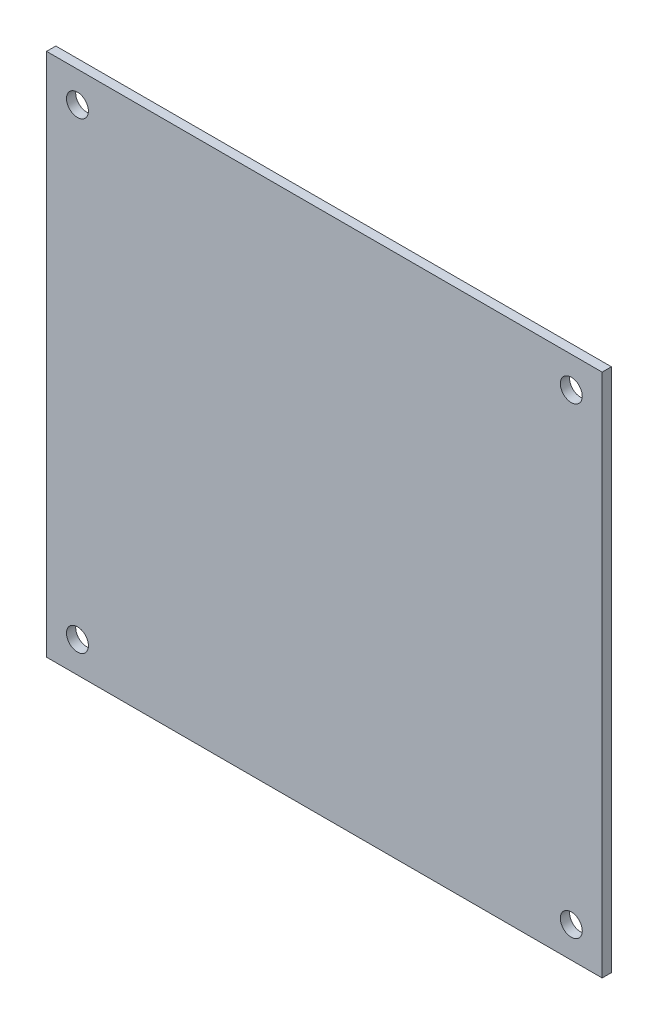
ISO-10303-21;
HEADER;
FILE_DESCRIPTION(('STEP AP214'),'2;1');
FILE_NAME('part.step','',(''),(''),'','','');
FILE_SCHEMA(('AUTOMOTIVE_DESIGN { 1 0 10303 214 1 1 1 1 }'));
ENDSEC;
DATA;
#1=APPLICATION_CONTEXT('core data for automotive mechanical design processes');
#2=APPLICATION_PROTOCOL_DEFINITION('international standard','automotive_design',2000,#1);
#3=PRODUCT_CONTEXT('',#1,'mechanical');
#4=PRODUCT('Part','Part','',(#3));
#5=PRODUCT_RELATED_PRODUCT_CATEGORY('part','',(#4));
#6=PRODUCT_DEFINITION_FORMATION('','',#4);
#7=PRODUCT_DEFINITION_CONTEXT('part definition',#1,'design');
#8=PRODUCT_DEFINITION('design','',#6,#7);
#9=PRODUCT_DEFINITION_SHAPE('','',#8);
#10=(LENGTH_UNIT() NAMED_UNIT(*) SI_UNIT(.MILLI.,.METRE.));
#11=(NAMED_UNIT(*) PLANE_ANGLE_UNIT() SI_UNIT($,.RADIAN.));
#12=(NAMED_UNIT(*) SI_UNIT($,.STERADIAN.) SOLID_ANGLE_UNIT());
#13=UNCERTAINTY_MEASURE_WITH_UNIT(LENGTH_MEASURE(1.E-05),#10,'distance_accuracy_value','');
#14=(GEOMETRIC_REPRESENTATION_CONTEXT(3) GLOBAL_UNCERTAINTY_ASSIGNED_CONTEXT((#13)) GLOBAL_UNIT_ASSIGNED_CONTEXT((#10,
#11,#12)) REPRESENTATION_CONTEXT('',''));
#15=CARTESIAN_POINT('',(0.,0.,0.));
#16=DIRECTION('',(0.,0.,1.));
#17=DIRECTION('',(1.,0.,0.));
#18=AXIS2_PLACEMENT_3D('',#15,#16,#17);
#19=CARTESIAN_POINT('',(0.,0.,1.5));
#20=DIRECTION('',(0.,0.,1.));
#21=DIRECTION('',(1.,0.,0.));
#22=AXIS2_PLACEMENT_3D('',#19,#20,#21);
#23=PLANE('',#22);
#24=CARTESIAN_POINT('',(40.,37.5,1.5));
#25=DIRECTION('',(0.,0.,1.));
#26=DIRECTION('',(1.,0.,0.));
#27=AXIS2_PLACEMENT_3D('',#24,#25,#26);
#28=CIRCLE('',#27,1.778);
#29=CARTESIAN_POINT('',(41.778,37.5,1.5));
#30=VERTEX_POINT('',#29);
#31=EDGE_CURVE('E121',#30,#30,#28,.T.);
#32=ORIENTED_EDGE('',*,*,#31,.F.);
#33=EDGE_LOOP('',(#32));
#34=FACE_BOUND('',#33,.T.);
#35=CARTESIAN_POINT('',(-40.,37.5,1.5));
#36=DIRECTION('',(0.,0.,1.));
#37=DIRECTION('',(1.,0.,0.));
#38=AXIS2_PLACEMENT_3D('',#35,#36,#37);
#39=CIRCLE('',#38,1.778);
#40=CARTESIAN_POINT('',(-38.222,37.5,1.5));
#41=VERTEX_POINT('',#40);
#42=EDGE_CURVE('E100',#41,#41,#39,.T.);
#43=ORIENTED_EDGE('',*,*,#42,.F.);
#44=EDGE_LOOP('',(#43));
#45=FACE_BOUND('',#44,.T.);
#46=DIRECTION('',(0.,1.,0.));
#47=VECTOR('',#46,1.);
#48=CARTESIAN_POINT('',(45.,42.5,1.5));
#49=LINE('',#48,#47);
#50=CARTESIAN_POINT('',(45.,-42.5,1.5));
#51=VERTEX_POINT('',#50);
#52=CARTESIAN_POINT('',(45.,42.5,1.5));
#53=VERTEX_POINT('',#52);
#54=EDGE_CURVE('E85',#51,#53,#49,.T.);
#55=ORIENTED_EDGE('',*,*,#54,.T.);
#56=DIRECTION('',(-1.,0.,0.));
#57=VECTOR('',#56,1.);
#58=CARTESIAN_POINT('',(-45.,42.5,1.5));
#59=LINE('',#58,#57);
#60=CARTESIAN_POINT('',(-45.,42.5,1.5));
#61=VERTEX_POINT('',#60);
#62=EDGE_CURVE('E80',#53,#61,#59,.T.);
#63=ORIENTED_EDGE('',*,*,#62,.T.);
#64=DIRECTION('',(0.,-1.,0.));
#65=VECTOR('',#64,1.);
#66=CARTESIAN_POINT('',(-45.,42.5,1.5));
#67=LINE('',#66,#65);
#68=CARTESIAN_POINT('',(-45.,-42.5,1.5));
#69=VERTEX_POINT('',#68);
#70=EDGE_CURVE('E83',#61,#69,#67,.T.);
#71=ORIENTED_EDGE('',*,*,#70,.T.);
#72=DIRECTION('',(1.,0.,0.));
#73=VECTOR('',#72,1.);
#74=CARTESIAN_POINT('',(-45.,-42.5,1.5));
#75=LINE('',#74,#73);
#76=EDGE_CURVE('E50',#69,#51,#75,.T.);
#77=ORIENTED_EDGE('',*,*,#76,.T.);
#78=EDGE_LOOP('',(#55,#63,#71,#77));
#79=FACE_BOUND('',#78,.T.);
#80=CARTESIAN_POINT('',(-40.,-37.5,1.5));
#81=DIRECTION('',(0.,0.,1.));
#82=DIRECTION('',(1.,0.,0.));
#83=AXIS2_PLACEMENT_3D('',#80,#81,#82);
#84=CIRCLE('',#83,1.778);
#85=CARTESIAN_POINT('',(-38.222,-37.5,1.5));
#86=VERTEX_POINT('',#85);
#87=EDGE_CURVE('E115',#86,#86,#84,.T.);
#88=ORIENTED_EDGE('',*,*,#87,.F.);
#89=EDGE_LOOP('',(#88));
#90=FACE_BOUND('',#89,.T.);
#91=CARTESIAN_POINT('',(40.,-37.5,1.5));
#92=DIRECTION('',(0.,0.,1.));
#93=DIRECTION('',(1.,0.,0.));
#94=AXIS2_PLACEMENT_3D('',#91,#92,#93);
#95=CIRCLE('',#94,1.778);
#96=CARTESIAN_POINT('',(41.778,-37.5,1.5));
#97=VERTEX_POINT('',#96);
#98=EDGE_CURVE('E127',#97,#97,#95,.T.);
#99=ORIENTED_EDGE('',*,*,#98,.F.);
#100=EDGE_LOOP('',(#99));
#101=FACE_BOUND('',#100,.T.);
#102=ADVANCED_FACE('F33',(#34,#45,#79,#90,#101),#23,.T.);
#103=CARTESIAN_POINT('',(0.,0.,0.));
#104=DIRECTION('',(0.,0.,1.));
#105=DIRECTION('',(1.,0.,0.));
#106=AXIS2_PLACEMENT_3D('',#103,#104,#105);
#107=PLANE('',#106);
#108=DIRECTION('',(0.,1.,0.));
#109=VECTOR('',#108,1.);
#110=CARTESIAN_POINT('',(45.,42.5,0.));
#111=LINE('',#110,#109);
#112=CARTESIAN_POINT('',(45.,-42.5,0.));
#113=VERTEX_POINT('',#112);
#114=CARTESIAN_POINT('',(45.,42.5,0.));
#115=VERTEX_POINT('',#114);
#116=EDGE_CURVE('E97',#113,#115,#111,.T.);
#117=ORIENTED_EDGE('',*,*,#116,.F.);
#118=DIRECTION('',(1.,0.,0.));
#119=VECTOR('',#118,1.);
#120=CARTESIAN_POINT('',(-45.,-42.5,0.));
#121=LINE('',#120,#119);
#122=CARTESIAN_POINT('',(-45.,-42.5,0.));
#123=VERTEX_POINT('',#122);
#124=EDGE_CURVE('E73',#123,#113,#121,.T.);
#125=ORIENTED_EDGE('',*,*,#124,.F.);
#126=DIRECTION('',(0.,-1.,0.));
#127=VECTOR('',#126,1.);
#128=CARTESIAN_POINT('',(-45.,42.5,0.));
#129=LINE('',#128,#127);
#130=CARTESIAN_POINT('',(-45.,42.5,0.));
#131=VERTEX_POINT('',#130);
#132=EDGE_CURVE('E67',#131,#123,#129,.T.);
#133=ORIENTED_EDGE('',*,*,#132,.F.);
#134=DIRECTION('',(-1.,0.,0.));
#135=VECTOR('',#134,1.);
#136=CARTESIAN_POINT('',(-45.,42.5,0.));
#137=LINE('',#136,#135);
#138=EDGE_CURVE('E89',#115,#131,#137,.T.);
#139=ORIENTED_EDGE('',*,*,#138,.F.);
#140=EDGE_LOOP('',(#117,#125,#133,#139));
#141=FACE_BOUND('',#140,.T.);
#142=CARTESIAN_POINT('',(-40.,37.5,0.));
#143=DIRECTION('',(0.,0.,1.));
#144=DIRECTION('',(1.,0.,0.));
#145=AXIS2_PLACEMENT_3D('',#142,#143,#144);
#146=CIRCLE('',#145,1.778);
#147=CARTESIAN_POINT('',(-38.222,37.5,0.));
#148=VERTEX_POINT('',#147);
#149=EDGE_CURVE('E112',#148,#148,#146,.T.);
#150=ORIENTED_EDGE('',*,*,#149,.T.);
#151=EDGE_LOOP('',(#150));
#152=FACE_BOUND('',#151,.T.);
#153=CARTESIAN_POINT('',(-40.,-37.5,0.));
#154=DIRECTION('',(0.,0.,1.));
#155=DIRECTION('',(1.,0.,0.));
#156=AXIS2_PLACEMENT_3D('',#153,#154,#155);
#157=CIRCLE('',#156,1.778);
#158=CARTESIAN_POINT('',(-38.222,-37.5,0.));
#159=VERTEX_POINT('',#158);
#160=EDGE_CURVE('E118',#159,#159,#157,.T.);
#161=ORIENTED_EDGE('',*,*,#160,.T.);
#162=EDGE_LOOP('',(#161));
#163=FACE_BOUND('',#162,.T.);
#164=CARTESIAN_POINT('',(40.,37.5,0.));
#165=DIRECTION('',(0.,0.,1.));
#166=DIRECTION('',(1.,0.,0.));
#167=AXIS2_PLACEMENT_3D('',#164,#165,#166);
#168=CIRCLE('',#167,1.778);
#169=CARTESIAN_POINT('',(41.778,37.5,0.));
#170=VERTEX_POINT('',#169);
#171=EDGE_CURVE('E124',#170,#170,#168,.T.);
#172=ORIENTED_EDGE('',*,*,#171,.T.);
#173=EDGE_LOOP('',(#172));
#174=FACE_BOUND('',#173,.T.);
#175=CARTESIAN_POINT('',(40.,-37.5,0.));
#176=DIRECTION('',(0.,0.,1.));
#177=DIRECTION('',(1.,0.,0.));
#178=AXIS2_PLACEMENT_3D('',#175,#176,#177);
#179=CIRCLE('',#178,1.778);
#180=CARTESIAN_POINT('',(41.778,-37.5,0.));
#181=VERTEX_POINT('',#180);
#182=EDGE_CURVE('E130',#181,#181,#179,.T.);
#183=ORIENTED_EDGE('',*,*,#182,.T.);
#184=EDGE_LOOP('',(#183));
#185=FACE_BOUND('',#184,.T.);
#186=ADVANCED_FACE('F108',(#141,#152,#163,#174,#185),#107,.F.);
#187=CARTESIAN_POINT('',(45.,42.5,1.5));
#188=DIRECTION('',(-1.,0.,0.));
#189=DIRECTION('',(0.,-1.,0.));
#190=AXIS2_PLACEMENT_3D('',#187,#188,#189);
#191=PLANE('',#190);
#192=ORIENTED_EDGE('',*,*,#116,.T.);
#193=DIRECTION('',(0.,0.,-1.));
#194=VECTOR('',#193,1.);
#195=CARTESIAN_POINT('',(45.,42.5,1.5));
#196=LINE('',#195,#194);
#197=EDGE_CURVE('E11',#53,#115,#196,.T.);
#198=ORIENTED_EDGE('',*,*,#197,.F.);
#199=ORIENTED_EDGE('',*,*,#54,.F.);
#200=DIRECTION('',(0.,0.,-1.));
#201=VECTOR('',#200,1.);
#202=CARTESIAN_POINT('',(45.,-42.5,1.5));
#203=LINE('',#202,#201);
#204=EDGE_CURVE('E93',#51,#113,#203,.T.);
#205=ORIENTED_EDGE('',*,*,#204,.T.);
#206=EDGE_LOOP('',(#192,#198,#199,#205));
#207=FACE_BOUND('',#206,.T.);
#208=ADVANCED_FACE('F35',(#207),#191,.F.);
#209=CARTESIAN_POINT('',(-45.,42.5,1.5));
#210=DIRECTION('',(0.,-1.,0.));
#211=DIRECTION('',(0.,0.,-1.));
#212=AXIS2_PLACEMENT_3D('',#209,#210,#211);
#213=PLANE('',#212);
#214=ORIENTED_EDGE('',*,*,#138,.T.);
#215=DIRECTION('',(0.,0.,-1.));
#216=VECTOR('',#215,1.);
#217=CARTESIAN_POINT('',(-45.,42.5,1.5));
#218=LINE('',#217,#216);
#219=EDGE_CURVE('E42',#61,#131,#218,.T.);
#220=ORIENTED_EDGE('',*,*,#219,.F.);
#221=ORIENTED_EDGE('',*,*,#62,.F.);
#222=ORIENTED_EDGE('',*,*,#197,.T.);
#223=EDGE_LOOP('',(#214,#220,#221,#222));
#224=FACE_BOUND('',#223,.T.);
#225=ADVANCED_FACE('F88',(#224),#213,.F.);
#226=CARTESIAN_POINT('',(-45.,42.5,1.5));
#227=DIRECTION('',(1.,0.,0.));
#228=DIRECTION('',(0.,1.,0.));
#229=AXIS2_PLACEMENT_3D('',#226,#227,#228);
#230=PLANE('',#229);
#231=ORIENTED_EDGE('',*,*,#132,.T.);
#232=DIRECTION('',(0.,0.,-1.));
#233=VECTOR('',#232,1.);
#234=CARTESIAN_POINT('',(-45.,-42.5,1.5));
#235=LINE('',#234,#233);
#236=EDGE_CURVE('E90',#69,#123,#235,.T.);
#237=ORIENTED_EDGE('',*,*,#236,.F.);
#238=ORIENTED_EDGE('',*,*,#70,.F.);
#239=ORIENTED_EDGE('',*,*,#219,.T.);
#240=EDGE_LOOP('',(#231,#237,#238,#239));
#241=FACE_BOUND('',#240,.T.);
#242=ADVANCED_FACE('F91',(#241),#230,.F.);
#243=CARTESIAN_POINT('',(-45.,-42.5,1.5));
#244=DIRECTION('',(0.,1.,0.));
#245=DIRECTION('',(0.,0.,1.));
#246=AXIS2_PLACEMENT_3D('',#243,#244,#245);
#247=PLANE('',#246);
#248=ORIENTED_EDGE('',*,*,#124,.T.);
#249=ORIENTED_EDGE('',*,*,#204,.F.);
#250=ORIENTED_EDGE('',*,*,#76,.F.);
#251=ORIENTED_EDGE('',*,*,#236,.T.);
#252=EDGE_LOOP('',(#248,#249,#250,#251));
#253=FACE_BOUND('',#252,.T.);
#254=ADVANCED_FACE('F105',(#253),#247,.F.);
#255=CARTESIAN_POINT('',(-40.,37.5,1.5));
#256=DIRECTION('',(0.,0.,-1.));
#257=DIRECTION('',(-1.,0.,0.));
#258=AXIS2_PLACEMENT_3D('',#255,#256,#257);
#259=CYLINDRICAL_SURFACE('',#258,1.778);
#260=ORIENTED_EDGE('',*,*,#42,.T.);
#261=EDGE_LOOP('',(#260));
#262=FACE_BOUND('',#261,.T.);
#263=ORIENTED_EDGE('',*,*,#149,.F.);
#264=EDGE_LOOP('',(#263));
#265=FACE_BOUND('',#264,.T.);
#266=ADVANCED_FACE('F149',(#262,#265),#259,.F.);
#267=CARTESIAN_POINT('',(-40.,-37.5,1.5));
#268=DIRECTION('',(0.,0.,-1.));
#269=DIRECTION('',(-1.,0.,0.));
#270=AXIS2_PLACEMENT_3D('',#267,#268,#269);
#271=CYLINDRICAL_SURFACE('',#270,1.778);
#272=ORIENTED_EDGE('',*,*,#87,.T.);
#273=EDGE_LOOP('',(#272));
#274=FACE_BOUND('',#273,.T.);
#275=ORIENTED_EDGE('',*,*,#160,.F.);
#276=EDGE_LOOP('',(#275));
#277=FACE_BOUND('',#276,.T.);
#278=ADVANCED_FACE('F195',(#274,#277),#271,.F.);
#279=CARTESIAN_POINT('',(40.,37.5,1.5));
#280=DIRECTION('',(0.,0.,-1.));
#281=DIRECTION('',(-1.,0.,0.));
#282=AXIS2_PLACEMENT_3D('',#279,#280,#281);
#283=CYLINDRICAL_SURFACE('',#282,1.778);
#284=ORIENTED_EDGE('',*,*,#31,.T.);
#285=EDGE_LOOP('',(#284));
#286=FACE_BOUND('',#285,.T.);
#287=ORIENTED_EDGE('',*,*,#171,.F.);
#288=EDGE_LOOP('',(#287));
#289=FACE_BOUND('',#288,.T.);
#290=ADVANCED_FACE('F203',(#286,#289),#283,.F.);
#291=CARTESIAN_POINT('',(40.,-37.5,1.5));
#292=DIRECTION('',(0.,0.,-1.));
#293=DIRECTION('',(-1.,0.,0.));
#294=AXIS2_PLACEMENT_3D('',#291,#292,#293);
#295=CYLINDRICAL_SURFACE('',#294,1.778);
#296=ORIENTED_EDGE('',*,*,#98,.T.);
#297=EDGE_LOOP('',(#296));
#298=FACE_BOUND('',#297,.T.);
#299=ORIENTED_EDGE('',*,*,#182,.F.);
#300=EDGE_LOOP('',(#299));
#301=FACE_BOUND('',#300,.T.);
#302=ADVANCED_FACE('F136',(#298,#301),#295,.F.);
#303=CLOSED_SHELL('',(#102,#186,#208,#225,#242,#254,#266,#278,#290,#302));
#304=MANIFOLD_SOLID_BREP('B2',#303);
#305=ADVANCED_BREP_SHAPE_REPRESENTATION('',(#18,#304),#14);
#306=SHAPE_DEFINITION_REPRESENTATION(#9,#305);
ENDSEC;
END-ISO-10303-21;
